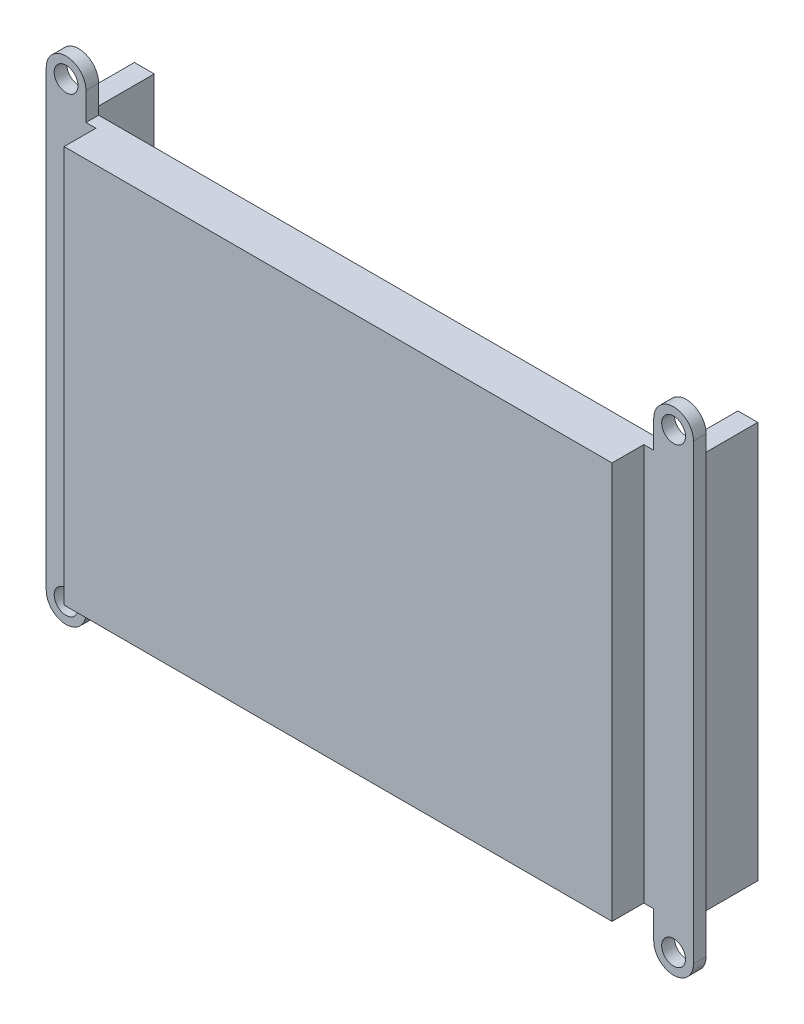
ISO-10303-21;
HEADER;
FILE_DESCRIPTION(('STEP AP214'),'2;1');
FILE_NAME('part.step','',(''),(''),'','','');
FILE_SCHEMA(('AUTOMOTIVE_DESIGN { 1 0 10303 214 1 1 1 1 }'));
ENDSEC;
DATA;
#1=APPLICATION_CONTEXT('core data for automotive mechanical design processes');
#2=APPLICATION_PROTOCOL_DEFINITION('international standard','automotive_design',2000,#1);
#3=PRODUCT_CONTEXT('',#1,'mechanical');
#4=PRODUCT('Part','Part','',(#3));
#5=PRODUCT_RELATED_PRODUCT_CATEGORY('part','',(#4));
#6=PRODUCT_DEFINITION_FORMATION('','',#4);
#7=PRODUCT_DEFINITION_CONTEXT('part definition',#1,'design');
#8=PRODUCT_DEFINITION('design','',#6,#7);
#9=PRODUCT_DEFINITION_SHAPE('','',#8);
#10=(LENGTH_UNIT() NAMED_UNIT(*) SI_UNIT(.MILLI.,.METRE.));
#11=(NAMED_UNIT(*) PLANE_ANGLE_UNIT() SI_UNIT($,.RADIAN.));
#12=(NAMED_UNIT(*) SI_UNIT($,.STERADIAN.) SOLID_ANGLE_UNIT());
#13=UNCERTAINTY_MEASURE_WITH_UNIT(LENGTH_MEASURE(1.E-05),#10,'distance_accuracy_value','');
#14=(GEOMETRIC_REPRESENTATION_CONTEXT(3) GLOBAL_UNCERTAINTY_ASSIGNED_CONTEXT((#13)) GLOBAL_UNIT_ASSIGNED_CONTEXT((#10,
#11,#12)) REPRESENTATION_CONTEXT('',''));
#15=CARTESIAN_POINT('',(0.,0.,0.));
#16=DIRECTION('',(0.,0.,1.));
#17=DIRECTION('',(1.,0.,0.));
#18=AXIS2_PLACEMENT_3D('',#15,#16,#17);
#19=CARTESIAN_POINT('',(0.,0.,-1.6));
#20=DIRECTION('',(0.,0.,1.));
#21=DIRECTION('',(1.,0.,0.));
#22=AXIS2_PLACEMENT_3D('',#19,#20,#21);
#23=PLANE('',#22);
#24=CARTESIAN_POINT('',(38.25,28.5,-1.6));
#25=DIRECTION('',(0.,0.,1.));
#26=DIRECTION('',(-1.,0.,0.));
#27=AXIS2_PLACEMENT_3D('',#24,#25,#26);
#28=CIRCLE('',#27,1.5);
#29=CARTESIAN_POINT('',(36.75,28.5,-1.6));
#30=VERTEX_POINT('',#29);
#31=EDGE_CURVE('E230',#30,#30,#28,.T.);
#32=ORIENTED_EDGE('',*,*,#31,.T.);
#33=EDGE_LOOP('',(#32));
#34=FACE_BOUND('',#33,.T.);
#35=CARTESIAN_POINT('',(38.25,-28.5,-1.6));
#36=DIRECTION('',(0.,0.,1.));
#37=DIRECTION('',(1.,0.,0.));
#38=AXIS2_PLACEMENT_3D('',#35,#36,#37);
#39=CIRCLE('',#38,1.5);
#40=CARTESIAN_POINT('',(39.75,-28.5,-1.6));
#41=VERTEX_POINT('',#40);
#42=EDGE_CURVE('E268',#41,#41,#39,.T.);
#43=ORIENTED_EDGE('',*,*,#42,.T.);
#44=EDGE_LOOP('',(#43));
#45=FACE_BOUND('',#44,.T.);
#46=CARTESIAN_POINT('',(-38.25,-28.5,-1.6));
#47=DIRECTION('',(0.,0.,1.));
#48=DIRECTION('',(-1.,0.,0.));
#49=AXIS2_PLACEMENT_3D('',#46,#47,#48);
#50=CIRCLE('',#49,1.5);
#51=CARTESIAN_POINT('',(-39.75,-28.5,-1.6));
#52=VERTEX_POINT('',#51);
#53=EDGE_CURVE('E305',#52,#52,#50,.T.);
#54=ORIENTED_EDGE('',*,*,#53,.T.);
#55=EDGE_LOOP('',(#54));
#56=FACE_BOUND('',#55,.T.);
#57=CARTESIAN_POINT('',(-38.25,28.5,-1.6));
#58=DIRECTION('',(0.,0.,1.));
#59=DIRECTION('',(1.,0.,0.));
#60=AXIS2_PLACEMENT_3D('',#57,#58,#59);
#61=CIRCLE('',#60,1.5);
#62=CARTESIAN_POINT('',(-36.75,28.5,-1.6));
#63=VERTEX_POINT('',#62);
#64=EDGE_CURVE('E340',#63,#63,#61,.T.);
#65=ORIENTED_EDGE('',*,*,#64,.T.);
#66=EDGE_LOOP('',(#65));
#67=FACE_BOUND('',#66,.T.);
#68=DIRECTION('',(1.,0.,0.));
#69=VECTOR('',#68,1.);
#70=CARTESIAN_POINT('',(40.75,25.,-1.6));
#71=LINE('',#70,#69);
#72=CARTESIAN_POINT('',(-35.75,25.,-1.6));
#73=VERTEX_POINT('',#72);
#74=CARTESIAN_POINT('',(35.75,25.,-1.6));
#75=VERTEX_POINT('',#74);
#76=EDGE_CURVE('E414',#73,#75,#71,.T.);
#77=ORIENTED_EDGE('',*,*,#76,.T.);
#78=DIRECTION('',(0.,-1.,0.));
#79=VECTOR('',#78,1.);
#80=CARTESIAN_POINT('',(35.75,25.,-1.6));
#81=LINE('',#80,#79);
#82=CARTESIAN_POINT('',(35.75,28.5,-1.6));
#83=VERTEX_POINT('',#82);
#84=EDGE_CURVE('E244',#83,#75,#81,.T.);
#85=ORIENTED_EDGE('',*,*,#84,.F.);
#86=CARTESIAN_POINT('',(38.25,28.5,-1.6));
#87=DIRECTION('',(0.,0.,1.));
#88=DIRECTION('',(-1.,0.,0.));
#89=AXIS2_PLACEMENT_3D('',#86,#87,#88);
#90=CIRCLE('',#89,2.5);
#91=CARTESIAN_POINT('',(40.75,28.5,-1.6));
#92=VERTEX_POINT('',#91);
#93=EDGE_CURVE('E240',#92,#83,#90,.T.);
#94=ORIENTED_EDGE('',*,*,#93,.F.);
#95=DIRECTION('',(0.,-1.,0.));
#96=VECTOR('',#95,1.);
#97=CARTESIAN_POINT('',(40.75,-25.,-1.6));
#98=LINE('',#97,#96);
#99=CARTESIAN_POINT('',(40.75,-28.5,-1.6));
#100=VERTEX_POINT('',#99);
#101=EDGE_CURVE('E419',#92,#100,#98,.T.);
#102=ORIENTED_EDGE('',*,*,#101,.T.);
#103=CARTESIAN_POINT('',(38.25,-28.5,-1.6));
#104=DIRECTION('',(0.,0.,1.));
#105=DIRECTION('',(1.,0.,0.));
#106=AXIS2_PLACEMENT_3D('',#103,#104,#105);
#107=CIRCLE('',#106,2.5);
#108=CARTESIAN_POINT('',(35.75,-28.5,-1.6));
#109=VERTEX_POINT('',#108);
#110=EDGE_CURVE('E276',#109,#100,#107,.T.);
#111=ORIENTED_EDGE('',*,*,#110,.F.);
#112=DIRECTION('',(0.,-1.,0.));
#113=VECTOR('',#112,1.);
#114=CARTESIAN_POINT('',(35.75,-25.,-1.6));
#115=LINE('',#114,#113);
#116=CARTESIAN_POINT('',(35.75,-25.,-1.6));
#117=VERTEX_POINT('',#116);
#118=EDGE_CURVE('E284',#117,#109,#115,.T.);
#119=ORIENTED_EDGE('',*,*,#118,.F.);
#120=DIRECTION('',(-1.,0.,0.));
#121=VECTOR('',#120,1.);
#122=CARTESIAN_POINT('',(40.75,-25.,-1.6));
#123=LINE('',#122,#121);
#124=CARTESIAN_POINT('',(-35.75,-25.,-1.6));
#125=VERTEX_POINT('',#124);
#126=EDGE_CURVE('E422',#117,#125,#123,.T.);
#127=ORIENTED_EDGE('',*,*,#126,.T.);
#128=DIRECTION('',(0.,1.,0.));
#129=VECTOR('',#128,1.);
#130=CARTESIAN_POINT('',(-35.75,-25.,-1.6));
#131=LINE('',#130,#129);
#132=CARTESIAN_POINT('',(-35.75,-28.5,-1.6));
#133=VERTEX_POINT('',#132);
#134=EDGE_CURVE('E317',#133,#125,#131,.T.);
#135=ORIENTED_EDGE('',*,*,#134,.F.);
#136=CARTESIAN_POINT('',(-38.25,-28.5,-1.6));
#137=DIRECTION('',(0.,0.,1.));
#138=DIRECTION('',(-1.,0.,0.));
#139=AXIS2_PLACEMENT_3D('',#136,#137,#138);
#140=CIRCLE('',#139,2.5);
#141=CARTESIAN_POINT('',(-40.75,-28.5,-1.6));
#142=VERTEX_POINT('',#141);
#143=EDGE_CURVE('E313',#142,#133,#140,.T.);
#144=ORIENTED_EDGE('',*,*,#143,.F.);
#145=DIRECTION('',(0.,1.,0.));
#146=VECTOR('',#145,1.);
#147=CARTESIAN_POINT('',(-40.75,-25.,-1.6));
#148=LINE('',#147,#146);
#149=CARTESIAN_POINT('',(-40.75,28.5,-1.6));
#150=VERTEX_POINT('',#149);
#151=EDGE_CURVE('E411',#142,#150,#148,.T.);
#152=ORIENTED_EDGE('',*,*,#151,.T.);
#153=CARTESIAN_POINT('',(-38.25,28.5,-1.6));
#154=DIRECTION('',(0.,0.,1.));
#155=DIRECTION('',(1.,0.,0.));
#156=AXIS2_PLACEMENT_3D('',#153,#154,#155);
#157=CIRCLE('',#156,2.5);
#158=CARTESIAN_POINT('',(-35.75,28.5,-1.6));
#159=VERTEX_POINT('',#158);
#160=EDGE_CURVE('E348',#159,#150,#157,.T.);
#161=ORIENTED_EDGE('',*,*,#160,.F.);
#162=DIRECTION('',(0.,1.,0.));
#163=VECTOR('',#162,1.);
#164=CARTESIAN_POINT('',(-35.75,25.,-1.6));
#165=LINE('',#164,#163);
#166=EDGE_CURVE('E352',#73,#159,#165,.T.);
#167=ORIENTED_EDGE('',*,*,#166,.F.);
#168=EDGE_LOOP('',(#77,#85,#94,#102,#111,#119,#127,#135,#144,#152,#161,#167));
#169=FACE_BOUND('',#168,.T.);
#170=DIRECTION('',(1.,0.,0.));
#171=VECTOR('',#170,1.);
#172=CARTESIAN_POINT('',(40.75,25.,-1.6));
#173=LINE('',#172,#171);
#174=CARTESIAN_POINT('',(36.75,25.,-1.6));
#175=VERTEX_POINT('',#174);
#176=CARTESIAN_POINT('',(39.25,25.,-1.6));
#177=VERTEX_POINT('',#176);
#178=EDGE_CURVE('E248',#175,#177,#173,.T.);
#179=ORIENTED_EDGE('',*,*,#178,.F.);
#180=DIRECTION('',(0.,1.,0.));
#181=VECTOR('',#180,1.);
#182=CARTESIAN_POINT('',(36.75,25.,-1.6));
#183=LINE('',#182,#181);
#184=CARTESIAN_POINT('',(36.75,-25.,-1.6));
#185=VERTEX_POINT('',#184);
#186=EDGE_CURVE('E380',#185,#175,#183,.T.);
#187=ORIENTED_EDGE('',*,*,#186,.F.);
#188=DIRECTION('',(-1.,0.,0.));
#189=VECTOR('',#188,1.);
#190=CARTESIAN_POINT('',(40.75,-25.,-1.6));
#191=LINE('',#190,#189);
#192=CARTESIAN_POINT('',(39.25,-25.,-1.6));
#193=VERTEX_POINT('',#192);
#194=EDGE_CURVE('E280',#193,#185,#191,.T.);
#195=ORIENTED_EDGE('',*,*,#194,.F.);
#196=DIRECTION('',(0.,-1.,0.));
#197=VECTOR('',#196,1.);
#198=CARTESIAN_POINT('',(39.25,25.,-1.6));
#199=LINE('',#198,#197);
#200=EDGE_CURVE('E367',#177,#193,#199,.T.);
#201=ORIENTED_EDGE('',*,*,#200,.F.);
#202=EDGE_LOOP('',(#179,#187,#195,#201));
#203=FACE_BOUND('',#202,.T.);
#204=DIRECTION('',(1.,0.,0.));
#205=VECTOR('',#204,1.);
#206=CARTESIAN_POINT('',(-39.25,25.,-1.6));
#207=LINE('',#206,#205);
#208=CARTESIAN_POINT('',(-39.25,25.,-1.6));
#209=VERTEX_POINT('',#208);
#210=CARTESIAN_POINT('',(-36.75,25.,-1.6));
#211=VERTEX_POINT('',#210);
#212=EDGE_CURVE('E223',#209,#211,#207,.T.);
#213=ORIENTED_EDGE('',*,*,#212,.F.);
#214=DIRECTION('',(0.,1.,0.));
#215=VECTOR('',#214,1.);
#216=CARTESIAN_POINT('',(-39.25,25.,-1.6));
#217=LINE('',#216,#215);
#218=CARTESIAN_POINT('',(-39.25,-25.,-1.6));
#219=VERTEX_POINT('',#218);
#220=EDGE_CURVE('E220',#219,#209,#217,.T.);
#221=ORIENTED_EDGE('',*,*,#220,.F.);
#222=DIRECTION('',(-1.,0.,0.));
#223=VECTOR('',#222,1.);
#224=CARTESIAN_POINT('',(-39.25,-25.,-1.6));
#225=LINE('',#224,#223);
#226=CARTESIAN_POINT('',(-36.75,-25.,-1.6));
#227=VERTEX_POINT('',#226);
#228=EDGE_CURVE('E60',#227,#219,#225,.T.);
#229=ORIENTED_EDGE('',*,*,#228,.F.);
#230=DIRECTION('',(0.,-1.,0.));
#231=VECTOR('',#230,1.);
#232=CARTESIAN_POINT('',(-36.75,25.,-1.6));
#233=LINE('',#232,#231);
#234=EDGE_CURVE('E55',#211,#227,#233,.T.);
#235=ORIENTED_EDGE('',*,*,#234,.F.);
#236=EDGE_LOOP('',(#213,#221,#229,#235));
#237=FACE_BOUND('',#236,.T.);
#238=ADVANCED_FACE('F39',(#34,#45,#56,#67,#169,#203,#237),#23,.F.);
#239=CARTESIAN_POINT('',(-34.5,25.,4.));
#240=DIRECTION('',(0.,-1.,0.));
#241=DIRECTION('',(0.,0.,-1.));
#242=AXIS2_PLACEMENT_3D('',#239,#240,#241);
#243=PLANE('',#242);
#244=DIRECTION('',(1.,0.,0.));
#245=VECTOR('',#244,1.);
#246=CARTESIAN_POINT('',(40.75,25.,0.));
#247=LINE('',#246,#245);
#248=CARTESIAN_POINT('',(34.5,25.,0.));
#249=VERTEX_POINT('',#248);
#250=CARTESIAN_POINT('',(35.75,25.,0.));
#251=VERTEX_POINT('',#250);
#252=EDGE_CURVE('E428',#249,#251,#247,.T.);
#253=ORIENTED_EDGE('',*,*,#252,.T.);
#254=DIRECTION('',(0.,0.,1.));
#255=VECTOR('',#254,1.);
#256=CARTESIAN_POINT('',(35.75,25.,-1.6));
#257=LINE('',#256,#255);
#258=EDGE_CURVE('E263',#75,#251,#257,.T.);
#259=ORIENTED_EDGE('',*,*,#258,.F.);
#260=ORIENTED_EDGE('',*,*,#76,.F.);
#261=DIRECTION('',(0.,0.,1.));
#262=VECTOR('',#261,1.);
#263=CARTESIAN_POINT('',(-35.75,25.,-1.6));
#264=LINE('',#263,#262);
#265=CARTESIAN_POINT('',(-35.75,25.,0.));
#266=VERTEX_POINT('',#265);
#267=EDGE_CURVE('E368',#73,#266,#264,.T.);
#268=ORIENTED_EDGE('',*,*,#267,.T.);
#269=CARTESIAN_POINT('',(-34.5,25.,0.));
#270=VERTEX_POINT('',#269);
#271=EDGE_CURVE('E429',#266,#270,#247,.T.);
#272=ORIENTED_EDGE('',*,*,#271,.T.);
#273=DIRECTION('',(0.,0.,-1.));
#274=VECTOR('',#273,1.);
#275=CARTESIAN_POINT('',(-34.5,25.,4.));
#276=LINE('',#275,#274);
#277=CARTESIAN_POINT('',(-34.5,25.,4.));
#278=VERTEX_POINT('',#277);
#279=EDGE_CURVE('E48',#278,#270,#276,.T.);
#280=ORIENTED_EDGE('',*,*,#279,.F.);
#281=DIRECTION('',(-1.,0.,0.));
#282=VECTOR('',#281,1.);
#283=CARTESIAN_POINT('',(-34.5,25.,4.));
#284=LINE('',#283,#282);
#285=CARTESIAN_POINT('',(34.5,25.,4.));
#286=VERTEX_POINT('',#285);
#287=EDGE_CURVE('E442',#286,#278,#284,.T.);
#288=ORIENTED_EDGE('',*,*,#287,.F.);
#289=DIRECTION('',(0.,0.,-1.));
#290=VECTOR('',#289,1.);
#291=CARTESIAN_POINT('',(34.5,25.,4.));
#292=LINE('',#291,#290);
#293=EDGE_CURVE('E11',#286,#249,#292,.T.);
#294=ORIENTED_EDGE('',*,*,#293,.T.);
#295=EDGE_LOOP('',(#253,#259,#260,#268,#272,#280,#288,#294));
#296=FACE_BOUND('',#295,.T.);
#297=ADVANCED_FACE('F475',(#296),#243,.F.);
#298=CARTESIAN_POINT('',(-34.5,-25.,4.));
#299=DIRECTION('',(0.,1.,0.));
#300=DIRECTION('',(0.,0.,1.));
#301=AXIS2_PLACEMENT_3D('',#298,#299,#300);
#302=PLANE('',#301);
#303=ORIENTED_EDGE('',*,*,#194,.T.);
#304=DIRECTION('',(0.,0.,1.));
#305=VECTOR('',#304,1.);
#306=CARTESIAN_POINT('',(36.75,-25.,-9.6));
#307=LINE('',#306,#305);
#308=CARTESIAN_POINT('',(36.75,-25.,-9.6));
#309=VERTEX_POINT('',#308);
#310=EDGE_CURVE('E403',#309,#185,#307,.T.);
#311=ORIENTED_EDGE('',*,*,#310,.F.);
#312=DIRECTION('',(-1.,0.,0.));
#313=VECTOR('',#312,1.);
#314=CARTESIAN_POINT('',(39.25,-25.,-9.6));
#315=LINE('',#314,#313);
#316=CARTESIAN_POINT('',(39.25,-25.,-9.6));
#317=VERTEX_POINT('',#316);
#318=EDGE_CURVE('E379',#317,#309,#315,.T.);
#319=ORIENTED_EDGE('',*,*,#318,.F.);
#320=DIRECTION('',(0.,0.,1.));
#321=VECTOR('',#320,1.);
#322=CARTESIAN_POINT('',(39.25,-25.,-9.6));
#323=LINE('',#322,#321);
#324=EDGE_CURVE('E407',#317,#193,#323,.T.);
#325=ORIENTED_EDGE('',*,*,#324,.T.);
#326=EDGE_LOOP('',(#303,#311,#319,#325));
#327=FACE_BOUND('',#326,.T.);
#328=ADVANCED_FACE('F537',(#327),#302,.F.);
#329=ORIENTED_EDGE('',*,*,#126,.F.);
#330=DIRECTION('',(0.,0.,1.));
#331=VECTOR('',#330,1.);
#332=CARTESIAN_POINT('',(35.75,-25.,-1.6));
#333=LINE('',#332,#331);
#334=CARTESIAN_POINT('',(35.75,-25.,0.));
#335=VERTEX_POINT('',#334);
#336=EDGE_CURVE('E299',#117,#335,#333,.T.);
#337=ORIENTED_EDGE('',*,*,#336,.T.);
#338=DIRECTION('',(-1.,0.,0.));
#339=VECTOR('',#338,1.);
#340=CARTESIAN_POINT('',(40.75,-25.,0.));
#341=LINE('',#340,#339);
#342=CARTESIAN_POINT('',(34.5,-25.,0.));
#343=VERTEX_POINT('',#342);
#344=EDGE_CURVE('E415',#335,#343,#341,.T.);
#345=ORIENTED_EDGE('',*,*,#344,.T.);
#346=DIRECTION('',(0.,0.,-1.));
#347=VECTOR('',#346,1.);
#348=CARTESIAN_POINT('',(34.5,-25.,4.));
#349=LINE('',#348,#347);
#350=CARTESIAN_POINT('',(34.5,-25.,4.));
#351=VERTEX_POINT('',#350);
#352=EDGE_CURVE('E452',#351,#343,#349,.T.);
#353=ORIENTED_EDGE('',*,*,#352,.F.);
#354=DIRECTION('',(1.,0.,0.));
#355=VECTOR('',#354,1.);
#356=CARTESIAN_POINT('',(-34.5,-25.,4.));
#357=LINE('',#356,#355);
#358=CARTESIAN_POINT('',(-34.5,-25.,4.));
#359=VERTEX_POINT('',#358);
#360=EDGE_CURVE('E449',#359,#351,#357,.T.);
#361=ORIENTED_EDGE('',*,*,#360,.F.);
#362=DIRECTION('',(0.,0.,-1.));
#363=VECTOR('',#362,1.);
#364=CARTESIAN_POINT('',(-34.5,-25.,4.));
#365=LINE('',#364,#363);
#366=CARTESIAN_POINT('',(-34.5,-25.,0.));
#367=VERTEX_POINT('',#366);
#368=EDGE_CURVE('E462',#359,#367,#365,.T.);
#369=ORIENTED_EDGE('',*,*,#368,.T.);
#370=CARTESIAN_POINT('',(-35.75,-25.,0.));
#371=VERTEX_POINT('',#370);
#372=EDGE_CURVE('E435',#367,#371,#341,.T.);
#373=ORIENTED_EDGE('',*,*,#372,.T.);
#374=DIRECTION('',(0.,0.,1.));
#375=VECTOR('',#374,1.);
#376=CARTESIAN_POINT('',(-35.75,-25.,-1.6));
#377=LINE('',#376,#375);
#378=EDGE_CURVE('E334',#125,#371,#377,.T.);
#379=ORIENTED_EDGE('',*,*,#378,.F.);
#380=EDGE_LOOP('',(#329,#337,#345,#353,#361,#369,#373,#379));
#381=FACE_BOUND('',#380,.T.);
#382=ADVANCED_FACE('F516',(#381),#302,.F.);
#383=CARTESIAN_POINT('',(34.5,-25.,4.));
#384=DIRECTION('',(-1.,0.,0.));
#385=DIRECTION('',(0.,0.,1.));
#386=AXIS2_PLACEMENT_3D('',#383,#384,#385);
#387=PLANE('',#386);
#388=DIRECTION('',(0.,1.,0.));
#389=VECTOR('',#388,1.);
#390=CARTESIAN_POINT('',(34.5,-25.,0.));
#391=LINE('',#390,#389);
#392=EDGE_CURVE('E425',#343,#249,#391,.T.);
#393=ORIENTED_EDGE('',*,*,#392,.T.);
#394=ORIENTED_EDGE('',*,*,#293,.F.);
#395=DIRECTION('',(0.,1.,0.));
#396=VECTOR('',#395,1.);
#397=CARTESIAN_POINT('',(34.5,-25.,4.));
#398=LINE('',#397,#396);
#399=EDGE_CURVE('E438',#351,#286,#398,.T.);
#400=ORIENTED_EDGE('',*,*,#399,.F.);
#401=ORIENTED_EDGE('',*,*,#352,.T.);
#402=EDGE_LOOP('',(#393,#394,#400,#401));
#403=FACE_BOUND('',#402,.T.);
#404=ADVANCED_FACE('F41',(#403),#387,.F.);
#405=DIRECTION('',(0.,0.,1.));
#406=VECTOR('',#405,1.);
#407=CARTESIAN_POINT('',(36.75,25.,-9.6));
#408=LINE('',#407,#406);
#409=CARTESIAN_POINT('',(36.75,25.,-9.6));
#410=VERTEX_POINT('',#409);
#411=EDGE_CURVE('E399',#410,#175,#408,.T.);
#412=ORIENTED_EDGE('',*,*,#411,.T.);
#413=ORIENTED_EDGE('',*,*,#178,.T.);
#414=DIRECTION('',(0.,0.,1.));
#415=VECTOR('',#414,1.);
#416=CARTESIAN_POINT('',(39.25,25.,-9.6));
#417=LINE('',#416,#415);
#418=CARTESIAN_POINT('',(39.25,25.,-9.6));
#419=VERTEX_POINT('',#418);
#420=EDGE_CURVE('E389',#419,#177,#417,.T.);
#421=ORIENTED_EDGE('',*,*,#420,.F.);
#422=DIRECTION('',(1.,0.,0.));
#423=VECTOR('',#422,1.);
#424=CARTESIAN_POINT('',(39.25,25.,-9.6));
#425=LINE('',#424,#423);
#426=EDGE_CURVE('E386',#410,#419,#425,.T.);
#427=ORIENTED_EDGE('',*,*,#426,.F.);
#428=EDGE_LOOP('',(#412,#413,#421,#427));
#429=FACE_BOUND('',#428,.T.);
#430=ADVANCED_FACE('F538',(#429),#243,.F.);
#431=CARTESIAN_POINT('',(-34.5,-25.,4.));
#432=DIRECTION('',(1.,0.,0.));
#433=DIRECTION('',(0.,0.,-1.));
#434=AXIS2_PLACEMENT_3D('',#431,#432,#433);
#435=PLANE('',#434);
#436=DIRECTION('',(0.,-1.,0.));
#437=VECTOR('',#436,1.);
#438=CARTESIAN_POINT('',(-34.5,-25.,0.));
#439=LINE('',#438,#437);
#440=EDGE_CURVE('E443',#270,#367,#439,.T.);
#441=ORIENTED_EDGE('',*,*,#440,.T.);
#442=ORIENTED_EDGE('',*,*,#368,.F.);
#443=DIRECTION('',(0.,-1.,0.));
#444=VECTOR('',#443,1.);
#445=CARTESIAN_POINT('',(-34.5,-25.,4.));
#446=LINE('',#445,#444);
#447=EDGE_CURVE('E446',#278,#359,#446,.T.);
#448=ORIENTED_EDGE('',*,*,#447,.F.);
#449=ORIENTED_EDGE('',*,*,#279,.T.);
#450=EDGE_LOOP('',(#441,#442,#448,#449));
#451=FACE_BOUND('',#450,.T.);
#452=ADVANCED_FACE('F470',(#451),#435,.F.);
#453=CARTESIAN_POINT('',(0.,0.,4.));
#454=DIRECTION('',(0.,0.,-1.));
#455=DIRECTION('',(-1.,0.,0.));
#456=AXIS2_PLACEMENT_3D('',#453,#454,#455);
#457=PLANE('',#456);
#458=ORIENTED_EDGE('',*,*,#399,.T.);
#459=ORIENTED_EDGE('',*,*,#287,.T.);
#460=ORIENTED_EDGE('',*,*,#447,.T.);
#461=ORIENTED_EDGE('',*,*,#360,.T.);
#462=EDGE_LOOP('',(#458,#459,#460,#461));
#463=FACE_BOUND('',#462,.T.);
#464=ADVANCED_FACE('F546',(#463),#457,.F.);
#465=CARTESIAN_POINT('',(0.,0.,0.));
#466=DIRECTION('',(0.,0.,1.));
#467=DIRECTION('',(1.,0.,0.));
#468=AXIS2_PLACEMENT_3D('',#465,#466,#467);
#469=PLANE('',#468);
#470=ORIENTED_EDGE('',*,*,#392,.F.);
#471=ORIENTED_EDGE('',*,*,#344,.F.);
#472=DIRECTION('',(0.,-1.,0.));
#473=VECTOR('',#472,1.);
#474=CARTESIAN_POINT('',(35.75,-25.,0.));
#475=LINE('',#474,#473);
#476=CARTESIAN_POINT('',(35.75,-28.5,0.));
#477=VERTEX_POINT('',#476);
#478=EDGE_CURVE('E281',#335,#477,#475,.T.);
#479=ORIENTED_EDGE('',*,*,#478,.T.);
#480=CARTESIAN_POINT('',(38.25,-28.5,0.));
#481=DIRECTION('',(0.,0.,1.));
#482=DIRECTION('',(1.,0.,0.));
#483=AXIS2_PLACEMENT_3D('',#480,#481,#482);
#484=CIRCLE('',#483,2.5);
#485=CARTESIAN_POINT('',(40.75,-28.5,0.));
#486=VERTEX_POINT('',#485);
#487=EDGE_CURVE('E272',#477,#486,#484,.T.);
#488=ORIENTED_EDGE('',*,*,#487,.T.);
#489=DIRECTION('',(0.,-1.,0.));
#490=VECTOR('',#489,1.);
#491=CARTESIAN_POINT('',(40.75,-25.,0.));
#492=LINE('',#491,#490);
#493=CARTESIAN_POINT('',(40.75,28.5,0.));
#494=VERTEX_POINT('',#493);
#495=EDGE_CURVE('E432',#494,#486,#492,.T.);
#496=ORIENTED_EDGE('',*,*,#495,.F.);
#497=CARTESIAN_POINT('',(38.25,28.5,0.));
#498=DIRECTION('',(0.,0.,1.));
#499=DIRECTION('',(-1.,0.,0.));
#500=AXIS2_PLACEMENT_3D('',#497,#498,#499);
#501=CIRCLE('',#500,2.5);
#502=CARTESIAN_POINT('',(35.75,28.5,0.));
#503=VERTEX_POINT('',#502);
#504=EDGE_CURVE('E238',#494,#503,#501,.T.);
#505=ORIENTED_EDGE('',*,*,#504,.T.);
#506=DIRECTION('',(0.,-1.,0.));
#507=VECTOR('',#506,1.);
#508=CARTESIAN_POINT('',(35.75,25.,0.));
#509=LINE('',#508,#507);
#510=EDGE_CURVE('E245',#503,#251,#509,.T.);
#511=ORIENTED_EDGE('',*,*,#510,.T.);
#512=ORIENTED_EDGE('',*,*,#252,.F.);
#513=EDGE_LOOP('',(#470,#471,#479,#488,#496,#505,#511,#512));
#514=FACE_BOUND('',#513,.T.);
#515=CARTESIAN_POINT('',(38.25,-28.5,0.));
#516=DIRECTION('',(0.,0.,1.));
#517=DIRECTION('',(1.,0.,0.));
#518=AXIS2_PLACEMENT_3D('',#515,#516,#517);
#519=CIRCLE('',#518,1.5);
#520=CARTESIAN_POINT('',(39.75,-28.5,0.));
#521=VERTEX_POINT('',#520);
#522=EDGE_CURVE('E262',#521,#521,#519,.T.);
#523=ORIENTED_EDGE('',*,*,#522,.F.);
#524=EDGE_LOOP('',(#523));
#525=FACE_BOUND('',#524,.T.);
#526=CARTESIAN_POINT('',(38.25,28.5,0.));
#527=DIRECTION('',(0.,0.,1.));
#528=DIRECTION('',(-1.,0.,0.));
#529=AXIS2_PLACEMENT_3D('',#526,#527,#528);
#530=CIRCLE('',#529,1.5);
#531=CARTESIAN_POINT('',(36.75,28.5,0.));
#532=VERTEX_POINT('',#531);
#533=EDGE_CURVE('E225',#532,#532,#530,.T.);
#534=ORIENTED_EDGE('',*,*,#533,.F.);
#535=EDGE_LOOP('',(#534));
#536=FACE_BOUND('',#535,.T.);
#537=ADVANCED_FACE('F490',(#514,#525,#536),#469,.T.);
#538=ORIENTED_EDGE('',*,*,#440,.F.);
#539=ORIENTED_EDGE('',*,*,#271,.F.);
#540=DIRECTION('',(0.,1.,0.));
#541=VECTOR('',#540,1.);
#542=CARTESIAN_POINT('',(-35.75,25.,0.));
#543=LINE('',#542,#541);
#544=CARTESIAN_POINT('',(-35.75,28.5,0.));
#545=VERTEX_POINT('',#544);
#546=EDGE_CURVE('E353',#266,#545,#543,.T.);
#547=ORIENTED_EDGE('',*,*,#546,.T.);
#548=CARTESIAN_POINT('',(-38.25,28.5,0.));
#549=DIRECTION('',(0.,0.,1.));
#550=DIRECTION('',(1.,0.,0.));
#551=AXIS2_PLACEMENT_3D('',#548,#549,#550);
#552=CIRCLE('',#551,2.5);
#553=CARTESIAN_POINT('',(-40.75,28.5,0.));
#554=VERTEX_POINT('',#553);
#555=EDGE_CURVE('E344',#545,#554,#552,.T.);
#556=ORIENTED_EDGE('',*,*,#555,.T.);
#557=DIRECTION('',(0.,1.,0.));
#558=VECTOR('',#557,1.);
#559=CARTESIAN_POINT('',(-40.75,-25.,0.));
#560=LINE('',#559,#558);
#561=CARTESIAN_POINT('',(-40.75,-28.5,0.));
#562=VERTEX_POINT('',#561);
#563=EDGE_CURVE('E410',#562,#554,#560,.T.);
#564=ORIENTED_EDGE('',*,*,#563,.F.);
#565=CARTESIAN_POINT('',(-38.25,-28.5,0.));
#566=DIRECTION('',(0.,0.,1.));
#567=DIRECTION('',(-1.,0.,0.));
#568=AXIS2_PLACEMENT_3D('',#565,#566,#567);
#569=CIRCLE('',#568,2.5);
#570=CARTESIAN_POINT('',(-35.75,-28.5,0.));
#571=VERTEX_POINT('',#570);
#572=EDGE_CURVE('E309',#562,#571,#569,.T.);
#573=ORIENTED_EDGE('',*,*,#572,.T.);
#574=DIRECTION('',(0.,1.,0.));
#575=VECTOR('',#574,1.);
#576=CARTESIAN_POINT('',(-35.75,-25.,0.));
#577=LINE('',#576,#575);
#578=EDGE_CURVE('E318',#571,#371,#577,.T.);
#579=ORIENTED_EDGE('',*,*,#578,.T.);
#580=ORIENTED_EDGE('',*,*,#372,.F.);
#581=EDGE_LOOP('',(#538,#539,#547,#556,#564,#573,#579,#580));
#582=FACE_BOUND('',#581,.T.);
#583=CARTESIAN_POINT('',(-38.25,28.5,0.));
#584=DIRECTION('',(0.,0.,1.));
#585=DIRECTION('',(1.,0.,0.));
#586=AXIS2_PLACEMENT_3D('',#583,#584,#585);
#587=CIRCLE('',#586,1.5);
#588=CARTESIAN_POINT('',(-36.75,28.5,0.));
#589=VERTEX_POINT('',#588);
#590=EDGE_CURVE('E333',#589,#589,#587,.T.);
#591=ORIENTED_EDGE('',*,*,#590,.F.);
#592=EDGE_LOOP('',(#591));
#593=FACE_BOUND('',#592,.T.);
#594=CARTESIAN_POINT('',(-38.25,-28.5,0.));
#595=DIRECTION('',(0.,0.,1.));
#596=DIRECTION('',(-1.,0.,0.));
#597=AXIS2_PLACEMENT_3D('',#594,#595,#596);
#598=CIRCLE('',#597,1.5);
#599=CARTESIAN_POINT('',(-39.75,-28.5,0.));
#600=VERTEX_POINT('',#599);
#601=EDGE_CURVE('E298',#600,#600,#598,.T.);
#602=ORIENTED_EDGE('',*,*,#601,.F.);
#603=EDGE_LOOP('',(#602));
#604=FACE_BOUND('',#603,.T.);
#605=ADVANCED_FACE('F479',(#582,#593,#604),#469,.T.);
#606=CARTESIAN_POINT('',(-40.75,-25.,-1.6));
#607=DIRECTION('',(1.,0.,0.));
#608=DIRECTION('',(0.,0.,-1.));
#609=AXIS2_PLACEMENT_3D('',#606,#607,#608);
#610=PLANE('',#609);
#611=ORIENTED_EDGE('',*,*,#563,.T.);
#612=DIRECTION('',(0.,0.,1.));
#613=VECTOR('',#612,1.);
#614=CARTESIAN_POINT('',(-40.75,28.5,-1.6));
#615=LINE('',#614,#613);
#616=EDGE_CURVE('E357',#150,#554,#615,.T.);
#617=ORIENTED_EDGE('',*,*,#616,.F.);
#618=ORIENTED_EDGE('',*,*,#151,.F.);
#619=DIRECTION('',(0.,0.,1.));
#620=VECTOR('',#619,1.);
#621=CARTESIAN_POINT('',(-40.75,-28.5,-1.6));
#622=LINE('',#621,#620);
#623=EDGE_CURVE('E329',#142,#562,#622,.T.);
#624=ORIENTED_EDGE('',*,*,#623,.T.);
#625=EDGE_LOOP('',(#611,#617,#618,#624));
#626=FACE_BOUND('',#625,.T.);
#627=ADVANCED_FACE('F549',(#626),#610,.F.);
#628=CARTESIAN_POINT('',(40.75,-25.,-1.6));
#629=DIRECTION('',(-1.,0.,0.));
#630=DIRECTION('',(0.,0.,1.));
#631=AXIS2_PLACEMENT_3D('',#628,#629,#630);
#632=PLANE('',#631);
#633=ORIENTED_EDGE('',*,*,#495,.T.);
#634=DIRECTION('',(0.,0.,1.));
#635=VECTOR('',#634,1.);
#636=CARTESIAN_POINT('',(40.75,-28.5,-1.6));
#637=LINE('',#636,#635);
#638=EDGE_CURVE('E288',#100,#486,#637,.T.);
#639=ORIENTED_EDGE('',*,*,#638,.F.);
#640=ORIENTED_EDGE('',*,*,#101,.F.);
#641=DIRECTION('',(0.,0.,1.));
#642=VECTOR('',#641,1.);
#643=CARTESIAN_POINT('',(40.75,28.5,-1.6));
#644=LINE('',#643,#642);
#645=EDGE_CURVE('E258',#92,#494,#644,.T.);
#646=ORIENTED_EDGE('',*,*,#645,.T.);
#647=EDGE_LOOP('',(#633,#639,#640,#646));
#648=FACE_BOUND('',#647,.T.);
#649=ADVANCED_FACE('F506',(#648),#632,.F.);
#650=CARTESIAN_POINT('',(39.25,25.,-9.6));
#651=DIRECTION('',(-1.,0.,0.));
#652=DIRECTION('',(0.,0.,1.));
#653=AXIS2_PLACEMENT_3D('',#650,#651,#652);
#654=PLANE('',#653);
#655=ORIENTED_EDGE('',*,*,#200,.T.);
#656=ORIENTED_EDGE('',*,*,#324,.F.);
#657=DIRECTION('',(0.,-1.,0.));
#658=VECTOR('',#657,1.);
#659=CARTESIAN_POINT('',(39.25,25.,-9.6));
#660=LINE('',#659,#658);
#661=EDGE_CURVE('E375',#419,#317,#660,.T.);
#662=ORIENTED_EDGE('',*,*,#661,.F.);
#663=ORIENTED_EDGE('',*,*,#420,.T.);
#664=EDGE_LOOP('',(#655,#656,#662,#663));
#665=FACE_BOUND('',#664,.T.);
#666=ADVANCED_FACE('F542',(#665),#654,.F.);
#667=CARTESIAN_POINT('',(36.75,25.,-9.6));
#668=DIRECTION('',(1.,0.,0.));
#669=DIRECTION('',(0.,1.,0.));
#670=AXIS2_PLACEMENT_3D('',#667,#668,#669);
#671=PLANE('',#670);
#672=ORIENTED_EDGE('',*,*,#186,.T.);
#673=ORIENTED_EDGE('',*,*,#411,.F.);
#674=DIRECTION('',(0.,1.,0.));
#675=VECTOR('',#674,1.);
#676=CARTESIAN_POINT('',(36.75,25.,-9.6));
#677=LINE('',#676,#675);
#678=EDGE_CURVE('E383',#309,#410,#677,.T.);
#679=ORIENTED_EDGE('',*,*,#678,.F.);
#680=ORIENTED_EDGE('',*,*,#310,.T.);
#681=EDGE_LOOP('',(#672,#673,#679,#680));
#682=FACE_BOUND('',#681,.T.);
#683=ADVANCED_FACE('F571',(#682),#671,.F.);
#684=CARTESIAN_POINT('',(0.,0.,-9.6));
#685=DIRECTION('',(0.,0.,-1.));
#686=DIRECTION('',(-1.,0.,0.));
#687=AXIS2_PLACEMENT_3D('',#684,#685,#686);
#688=PLANE('',#687);
#689=ORIENTED_EDGE('',*,*,#661,.T.);
#690=ORIENTED_EDGE('',*,*,#318,.T.);
#691=ORIENTED_EDGE('',*,*,#678,.T.);
#692=ORIENTED_EDGE('',*,*,#426,.T.);
#693=EDGE_LOOP('',(#689,#690,#691,#692));
#694=FACE_BOUND('',#693,.T.);
#695=ADVANCED_FACE('F579',(#694),#688,.T.);
#696=CARTESIAN_POINT('',(-38.25,28.5,-1.6));
#697=DIRECTION('',(0.,0.,1.));
#698=DIRECTION('',(1.,0.,0.));
#699=AXIS2_PLACEMENT_3D('',#696,#697,#698);
#700=CYLINDRICAL_SURFACE('',#699,2.5);
#701=ORIENTED_EDGE('',*,*,#555,.F.);
#702=DIRECTION('',(0.,0.,1.));
#703=VECTOR('',#702,1.);
#704=CARTESIAN_POINT('',(-35.75,28.5,-1.6));
#705=LINE('',#704,#703);
#706=EDGE_CURVE('E364',#159,#545,#705,.T.);
#707=ORIENTED_EDGE('',*,*,#706,.F.);
#708=ORIENTED_EDGE('',*,*,#160,.T.);
#709=ORIENTED_EDGE('',*,*,#616,.T.);
#710=EDGE_LOOP('',(#701,#707,#708,#709));
#711=FACE_BOUND('',#710,.T.);
#712=ADVANCED_FACE('F664',(#711),#700,.T.);
#713=CARTESIAN_POINT('',(-35.75,25.,-1.6));
#714=DIRECTION('',(1.,0.,0.));
#715=DIRECTION('',(0.,0.,-1.));
#716=AXIS2_PLACEMENT_3D('',#713,#714,#715);
#717=PLANE('',#716);
#718=ORIENTED_EDGE('',*,*,#546,.F.);
#719=ORIENTED_EDGE('',*,*,#267,.F.);
#720=ORIENTED_EDGE('',*,*,#166,.T.);
#721=ORIENTED_EDGE('',*,*,#706,.T.);
#722=EDGE_LOOP('',(#718,#719,#720,#721));
#723=FACE_BOUND('',#722,.T.);
#724=ADVANCED_FACE('F777',(#723),#717,.T.);
#725=CARTESIAN_POINT('',(-38.25,28.5,-1.6));
#726=DIRECTION('',(0.,0.,1.));
#727=DIRECTION('',(1.,0.,0.));
#728=AXIS2_PLACEMENT_3D('',#725,#726,#727);
#729=CYLINDRICAL_SURFACE('',#728,1.5);
#730=ORIENTED_EDGE('',*,*,#64,.F.);
#731=EDGE_LOOP('',(#730));
#732=FACE_BOUND('',#731,.T.);
#733=ORIENTED_EDGE('',*,*,#590,.T.);
#734=EDGE_LOOP('',(#733));
#735=FACE_BOUND('',#734,.T.);
#736=ADVANCED_FACE('F767',(#732,#735),#729,.F.);
#737=CARTESIAN_POINT('',(-38.25,-28.5,-1.6));
#738=DIRECTION('',(0.,0.,1.));
#739=DIRECTION('',(1.,0.,0.));
#740=AXIS2_PLACEMENT_3D('',#737,#738,#739);
#741=CYLINDRICAL_SURFACE('',#740,2.5);
#742=ORIENTED_EDGE('',*,*,#572,.F.);
#743=ORIENTED_EDGE('',*,*,#623,.F.);
#744=ORIENTED_EDGE('',*,*,#143,.T.);
#745=DIRECTION('',(0.,0.,1.));
#746=VECTOR('',#745,1.);
#747=CARTESIAN_POINT('',(-35.75,-28.5,-1.6));
#748=LINE('',#747,#746);
#749=EDGE_CURVE('E322',#133,#571,#748,.T.);
#750=ORIENTED_EDGE('',*,*,#749,.T.);
#751=EDGE_LOOP('',(#742,#743,#744,#750));
#752=FACE_BOUND('',#751,.T.);
#753=ADVANCED_FACE('F758',(#752),#741,.T.);
#754=CARTESIAN_POINT('',(-35.75,-25.,-1.6));
#755=DIRECTION('',(1.,0.,0.));
#756=DIRECTION('',(0.,0.,-1.));
#757=AXIS2_PLACEMENT_3D('',#754,#755,#756);
#758=PLANE('',#757);
#759=ORIENTED_EDGE('',*,*,#578,.F.);
#760=ORIENTED_EDGE('',*,*,#749,.F.);
#761=ORIENTED_EDGE('',*,*,#134,.T.);
#762=ORIENTED_EDGE('',*,*,#378,.T.);
#763=EDGE_LOOP('',(#759,#760,#761,#762));
#764=FACE_BOUND('',#763,.T.);
#765=ADVANCED_FACE('F528',(#764),#758,.T.);
#766=CARTESIAN_POINT('',(-38.25,-28.5,-1.6));
#767=DIRECTION('',(0.,0.,1.));
#768=DIRECTION('',(1.,0.,0.));
#769=AXIS2_PLACEMENT_3D('',#766,#767,#768);
#770=CYLINDRICAL_SURFACE('',#769,1.5);
#771=ORIENTED_EDGE('',*,*,#53,.F.);
#772=EDGE_LOOP('',(#771));
#773=FACE_BOUND('',#772,.T.);
#774=ORIENTED_EDGE('',*,*,#601,.T.);
#775=EDGE_LOOP('',(#774));
#776=FACE_BOUND('',#775,.T.);
#777=ADVANCED_FACE('F520',(#773,#776),#770,.F.);
#778=CARTESIAN_POINT('',(38.25,-28.5,-1.6));
#779=DIRECTION('',(0.,0.,1.));
#780=DIRECTION('',(1.,0.,0.));
#781=AXIS2_PLACEMENT_3D('',#778,#779,#780);
#782=CYLINDRICAL_SURFACE('',#781,2.5);
#783=ORIENTED_EDGE('',*,*,#487,.F.);
#784=DIRECTION('',(0.,0.,1.));
#785=VECTOR('',#784,1.);
#786=CARTESIAN_POINT('',(35.75,-28.5,-1.6));
#787=LINE('',#786,#785);
#788=EDGE_CURVE('E295',#109,#477,#787,.T.);
#789=ORIENTED_EDGE('',*,*,#788,.F.);
#790=ORIENTED_EDGE('',*,*,#110,.T.);
#791=ORIENTED_EDGE('',*,*,#638,.T.);
#792=EDGE_LOOP('',(#783,#789,#790,#791));
#793=FACE_BOUND('',#792,.T.);
#794=ADVANCED_FACE('F518',(#793),#782,.T.);
#795=CARTESIAN_POINT('',(35.75,-25.,-1.6));
#796=DIRECTION('',(-1.,0.,0.));
#797=DIRECTION('',(0.,0.,1.));
#798=AXIS2_PLACEMENT_3D('',#795,#796,#797);
#799=PLANE('',#798);
#800=ORIENTED_EDGE('',*,*,#478,.F.);
#801=ORIENTED_EDGE('',*,*,#336,.F.);
#802=ORIENTED_EDGE('',*,*,#118,.T.);
#803=ORIENTED_EDGE('',*,*,#788,.T.);
#804=EDGE_LOOP('',(#800,#801,#802,#803));
#805=FACE_BOUND('',#804,.T.);
#806=ADVANCED_FACE('F514',(#805),#799,.T.);
#807=CARTESIAN_POINT('',(38.25,-28.5,-1.6));
#808=DIRECTION('',(0.,0.,1.));
#809=DIRECTION('',(1.,0.,0.));
#810=AXIS2_PLACEMENT_3D('',#807,#808,#809);
#811=CYLINDRICAL_SURFACE('',#810,1.5);
#812=ORIENTED_EDGE('',*,*,#42,.F.);
#813=EDGE_LOOP('',(#812));
#814=FACE_BOUND('',#813,.T.);
#815=ORIENTED_EDGE('',*,*,#522,.T.);
#816=EDGE_LOOP('',(#815));
#817=FACE_BOUND('',#816,.T.);
#818=ADVANCED_FACE('F526',(#814,#817),#811,.F.);
#819=CARTESIAN_POINT('',(38.25,28.5,-1.6));
#820=DIRECTION('',(0.,0.,1.));
#821=DIRECTION('',(1.,0.,0.));
#822=AXIS2_PLACEMENT_3D('',#819,#820,#821);
#823=CYLINDRICAL_SURFACE('',#822,2.5);
#824=ORIENTED_EDGE('',*,*,#504,.F.);
#825=ORIENTED_EDGE('',*,*,#645,.F.);
#826=ORIENTED_EDGE('',*,*,#93,.T.);
#827=DIRECTION('',(0.,0.,1.));
#828=VECTOR('',#827,1.);
#829=CARTESIAN_POINT('',(35.75,28.5,-1.6));
#830=LINE('',#829,#828);
#831=EDGE_CURVE('E251',#83,#503,#830,.T.);
#832=ORIENTED_EDGE('',*,*,#831,.T.);
#833=EDGE_LOOP('',(#824,#825,#826,#832));
#834=FACE_BOUND('',#833,.T.);
#835=ADVANCED_FACE('F504',(#834),#823,.T.);
#836=CARTESIAN_POINT('',(35.75,25.,-1.6));
#837=DIRECTION('',(-1.,0.,0.));
#838=DIRECTION('',(0.,0.,1.));
#839=AXIS2_PLACEMENT_3D('',#836,#837,#838);
#840=PLANE('',#839);
#841=ORIENTED_EDGE('',*,*,#510,.F.);
#842=ORIENTED_EDGE('',*,*,#831,.F.);
#843=ORIENTED_EDGE('',*,*,#84,.T.);
#844=ORIENTED_EDGE('',*,*,#258,.T.);
#845=EDGE_LOOP('',(#841,#842,#843,#844));
#846=FACE_BOUND('',#845,.T.);
#847=ADVANCED_FACE('F496',(#846),#840,.T.);
#848=CARTESIAN_POINT('',(38.25,28.5,-1.6));
#849=DIRECTION('',(0.,0.,1.));
#850=DIRECTION('',(1.,0.,0.));
#851=AXIS2_PLACEMENT_3D('',#848,#849,#850);
#852=CYLINDRICAL_SURFACE('',#851,1.5);
#853=ORIENTED_EDGE('',*,*,#31,.F.);
#854=EDGE_LOOP('',(#853));
#855=FACE_BOUND('',#854,.T.);
#856=ORIENTED_EDGE('',*,*,#533,.T.);
#857=EDGE_LOOP('',(#856));
#858=FACE_BOUND('',#857,.T.);
#859=ADVANCED_FACE('F673',(#855,#858),#852,.F.);
#860=CARTESIAN_POINT('',(-39.25,25.,-9.6));
#861=DIRECTION('',(0.,-1.,0.));
#862=DIRECTION('',(0.,0.,-1.));
#863=AXIS2_PLACEMENT_3D('',#860,#861,#862);
#864=PLANE('',#863);
#865=ORIENTED_EDGE('',*,*,#212,.T.);
#866=DIRECTION('',(0.,0.,1.));
#867=VECTOR('',#866,1.);
#868=CARTESIAN_POINT('',(-36.75,25.,-9.6));
#869=LINE('',#868,#867);
#870=CARTESIAN_POINT('',(-36.75,25.,-9.6));
#871=VERTEX_POINT('',#870);
#872=EDGE_CURVE('E202',#871,#211,#869,.T.);
#873=ORIENTED_EDGE('',*,*,#872,.F.);
#874=DIRECTION('',(1.,0.,0.));
#875=VECTOR('',#874,1.);
#876=CARTESIAN_POINT('',(-39.25,25.,-9.6));
#877=LINE('',#876,#875);
#878=CARTESIAN_POINT('',(-39.25,25.,-9.6));
#879=VERTEX_POINT('',#878);
#880=EDGE_CURVE('E210',#879,#871,#877,.T.);
#881=ORIENTED_EDGE('',*,*,#880,.F.);
#882=DIRECTION('',(0.,0.,1.));
#883=VECTOR('',#882,1.);
#884=CARTESIAN_POINT('',(-39.25,25.,-9.6));
#885=LINE('',#884,#883);
#886=EDGE_CURVE('E898',#879,#209,#885,.T.);
#887=ORIENTED_EDGE('',*,*,#886,.T.);
#888=EDGE_LOOP('',(#865,#873,#881,#887));
#889=FACE_BOUND('',#888,.T.);
#890=ADVANCED_FACE('F222',(#889),#864,.F.);
#891=CARTESIAN_POINT('',(-36.75,25.,-9.6));
#892=DIRECTION('',(-1.,0.,0.));
#893=DIRECTION('',(0.,-1.,0.));
#894=AXIS2_PLACEMENT_3D('',#891,#892,#893);
#895=PLANE('',#894);
#896=ORIENTED_EDGE('',*,*,#234,.T.);
#897=DIRECTION('',(0.,0.,1.));
#898=VECTOR('',#897,1.);
#899=CARTESIAN_POINT('',(-36.75,-25.,-9.6));
#900=LINE('',#899,#898);
#901=CARTESIAN_POINT('',(-36.75,-25.,-9.6));
#902=VERTEX_POINT('',#901);
#903=EDGE_CURVE('E205',#902,#227,#900,.T.);
#904=ORIENTED_EDGE('',*,*,#903,.F.);
#905=DIRECTION('',(0.,-1.,0.));
#906=VECTOR('',#905,1.);
#907=CARTESIAN_POINT('',(-36.75,25.,-9.6));
#908=LINE('',#907,#906);
#909=EDGE_CURVE('E198',#871,#902,#908,.T.);
#910=ORIENTED_EDGE('',*,*,#909,.F.);
#911=ORIENTED_EDGE('',*,*,#872,.T.);
#912=EDGE_LOOP('',(#896,#904,#910,#911));
#913=FACE_BOUND('',#912,.T.);
#914=ADVANCED_FACE('F200',(#913),#895,.F.);
#915=CARTESIAN_POINT('',(-39.25,-25.,-9.6));
#916=DIRECTION('',(0.,1.,0.));
#917=DIRECTION('',(0.,0.,1.));
#918=AXIS2_PLACEMENT_3D('',#915,#916,#917);
#919=PLANE('',#918);
#920=ORIENTED_EDGE('',*,*,#228,.T.);
#921=DIRECTION('',(0.,0.,1.));
#922=VECTOR('',#921,1.);
#923=CARTESIAN_POINT('',(-39.25,-25.,-9.6));
#924=LINE('',#923,#922);
#925=CARTESIAN_POINT('',(-39.25,-25.,-9.6));
#926=VERTEX_POINT('',#925);
#927=EDGE_CURVE('E232',#926,#219,#924,.T.);
#928=ORIENTED_EDGE('',*,*,#927,.F.);
#929=DIRECTION('',(-1.,0.,0.));
#930=VECTOR('',#929,1.);
#931=CARTESIAN_POINT('',(-39.25,-25.,-9.6));
#932=LINE('',#931,#930);
#933=EDGE_CURVE('E209',#902,#926,#932,.T.);
#934=ORIENTED_EDGE('',*,*,#933,.F.);
#935=ORIENTED_EDGE('',*,*,#903,.T.);
#936=EDGE_LOOP('',(#920,#928,#934,#935));
#937=FACE_BOUND('',#936,.T.);
#938=ADVANCED_FACE('F682',(#937),#919,.F.);
#939=CARTESIAN_POINT('',(-39.25,25.,-9.6));
#940=DIRECTION('',(1.,0.,0.));
#941=DIRECTION('',(0.,0.,-1.));
#942=AXIS2_PLACEMENT_3D('',#939,#940,#941);
#943=PLANE('',#942);
#944=ORIENTED_EDGE('',*,*,#220,.T.);
#945=ORIENTED_EDGE('',*,*,#886,.F.);
#946=DIRECTION('',(0.,1.,0.));
#947=VECTOR('',#946,1.);
#948=CARTESIAN_POINT('',(-39.25,25.,-9.6));
#949=LINE('',#948,#947);
#950=EDGE_CURVE('E215',#926,#879,#949,.T.);
#951=ORIENTED_EDGE('',*,*,#950,.F.);
#952=ORIENTED_EDGE('',*,*,#927,.T.);
#953=EDGE_LOOP('',(#944,#945,#951,#952));
#954=FACE_BOUND('',#953,.T.);
#955=ADVANCED_FACE('F690',(#954),#943,.F.);
#956=CARTESIAN_POINT('',(0.,0.,-9.6));
#957=DIRECTION('',(0.,0.,-1.));
#958=DIRECTION('',(-1.,0.,0.));
#959=AXIS2_PLACEMENT_3D('',#956,#957,#958);
#960=PLANE('',#959);
#961=ORIENTED_EDGE('',*,*,#880,.T.);
#962=ORIENTED_EDGE('',*,*,#909,.T.);
#963=ORIENTED_EDGE('',*,*,#933,.T.);
#964=ORIENTED_EDGE('',*,*,#950,.T.);
#965=EDGE_LOOP('',(#961,#962,#963,#964));
#966=FACE_BOUND('',#965,.T.);
#967=ADVANCED_FACE('F213',(#966),#960,.T.);
#968=CLOSED_SHELL('',(#238,#297,#328,#382,#404,#430,#452,#464,#537,#605,#627,#649,#666,#683,
#695,#712,#724,#736,#753,#765,#777,#794,#806,#818,#835,#847,#859,#890,#914,#938,#955,#967));
#969=MANIFOLD_SOLID_BREP('B2',#968);
#970=ADVANCED_BREP_SHAPE_REPRESENTATION('',(#18,#969),#14);
#971=SHAPE_DEFINITION_REPRESENTATION(#9,#970);
ENDSEC;
END-ISO-10303-21;
